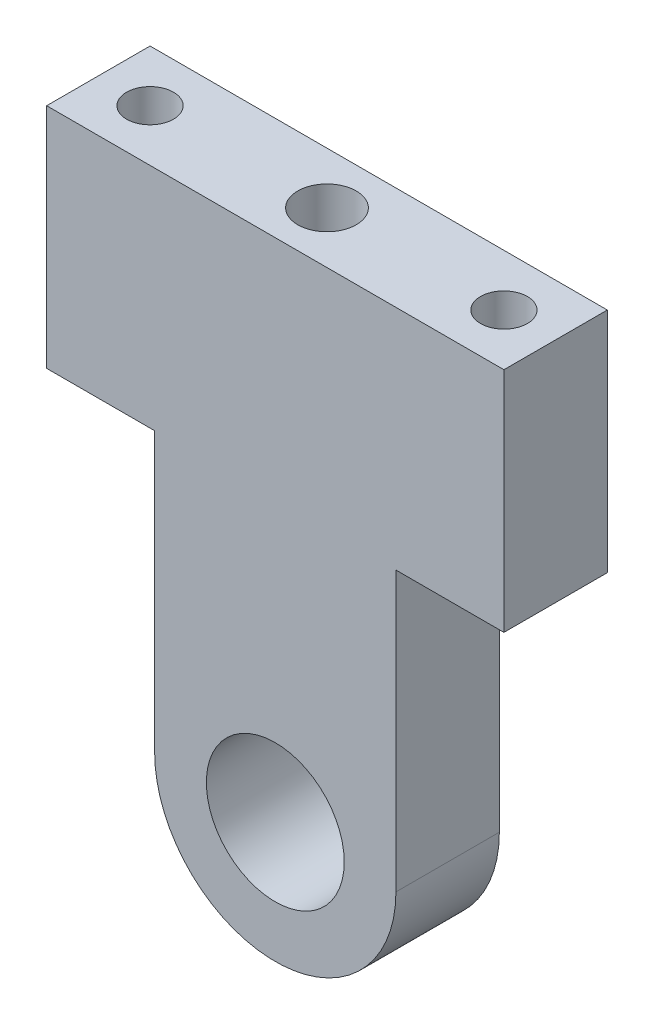
ISO-10303-21;
HEADER;
FILE_DESCRIPTION(('STEP AP214'),'2;1');
FILE_NAME('part.step','',(''),(''),'','','');
FILE_SCHEMA(('AUTOMOTIVE_DESIGN { 1 0 10303 214 1 1 1 1 }'));
ENDSEC;
DATA;
#1=APPLICATION_CONTEXT('core data for automotive mechanical design processes');
#2=APPLICATION_PROTOCOL_DEFINITION('international standard','automotive_design',2000,#1);
#3=PRODUCT_CONTEXT('',#1,'mechanical');
#4=PRODUCT('Part','Part','',(#3));
#5=PRODUCT_RELATED_PRODUCT_CATEGORY('part','',(#4));
#6=PRODUCT_DEFINITION_FORMATION('','',#4);
#7=PRODUCT_DEFINITION_CONTEXT('part definition',#1,'design');
#8=PRODUCT_DEFINITION('design','',#6,#7);
#9=PRODUCT_DEFINITION_SHAPE('','',#8);
#10=(LENGTH_UNIT() NAMED_UNIT(*) SI_UNIT(.MILLI.,.METRE.));
#11=(NAMED_UNIT(*) PLANE_ANGLE_UNIT() SI_UNIT($,.RADIAN.));
#12=(NAMED_UNIT(*) SI_UNIT($,.STERADIAN.) SOLID_ANGLE_UNIT());
#13=UNCERTAINTY_MEASURE_WITH_UNIT(LENGTH_MEASURE(1.E-05),#10,'distance_accuracy_value','');
#14=(GEOMETRIC_REPRESENTATION_CONTEXT(3) GLOBAL_UNCERTAINTY_ASSIGNED_CONTEXT((#13)) GLOBAL_UNIT_ASSIGNED_CONTEXT((#10,
#11,#12)) REPRESENTATION_CONTEXT('',''));
#15=CARTESIAN_POINT('',(0.,0.,0.));
#16=DIRECTION('',(0.,0.,1.));
#17=DIRECTION('',(1.,0.,0.));
#18=AXIS2_PLACEMENT_3D('',#15,#16,#17);
#19=CARTESIAN_POINT('',(33.165,-40.433566532219,15.));
#20=DIRECTION('',(0.,0.,1.));
#21=DIRECTION('',(1.,0.,0.));
#22=AXIS2_PLACEMENT_3D('',#19,#20,#21);
#23=PLANE('',#22);
#24=DIRECTION('',(1.,0.,0.));
#25=VECTOR('',#24,1.);
#26=CARTESIAN_POINT('',(0.,0.,15.));
#27=LINE('',#26,#25);
#28=CARTESIAN_POINT('',(0.,0.,15.));
#29=VERTEX_POINT('',#28);
#30=CARTESIAN_POINT('',(15.665,0.,15.));
#31=VERTEX_POINT('',#30);
#32=EDGE_CURVE('E151',#29,#31,#27,.T.);
#33=ORIENTED_EDGE('',*,*,#32,.T.);
#34=DIRECTION('',(0.,-1.,0.));
#35=VECTOR('',#34,1.);
#36=CARTESIAN_POINT('',(15.665,0.,15.));
#37=LINE('',#36,#35);
#38=CARTESIAN_POINT('',(15.665,-40.433566532219,15.));
#39=VERTEX_POINT('',#38);
#40=EDGE_CURVE('E99',#31,#39,#37,.T.);
#41=ORIENTED_EDGE('',*,*,#40,.T.);
#42=CARTESIAN_POINT('',(33.165,-40.433566532219,15.));
#43=DIRECTION('',(0.,0.,1.));
#44=DIRECTION('',(1.,0.,0.));
#45=AXIS2_PLACEMENT_3D('',#42,#43,#44);
#46=CIRCLE('',#45,17.5);
#47=CARTESIAN_POINT('',(50.665,-40.433566532219,15.));
#48=VERTEX_POINT('',#47);
#49=EDGE_CURVE('E166',#39,#48,#46,.T.);
#50=ORIENTED_EDGE('',*,*,#49,.T.);
#51=DIRECTION('',(0.,1.,0.));
#52=VECTOR('',#51,1.);
#53=CARTESIAN_POINT('',(50.665,0.,15.));
#54=LINE('',#53,#52);
#55=CARTESIAN_POINT('',(50.665,0.,15.));
#56=VERTEX_POINT('',#55);
#57=EDGE_CURVE('E179',#48,#56,#54,.T.);
#58=ORIENTED_EDGE('',*,*,#57,.T.);
#59=DIRECTION('',(1.,0.,0.));
#60=VECTOR('',#59,1.);
#61=CARTESIAN_POINT('',(50.665,0.,15.));
#62=LINE('',#61,#60);
#63=CARTESIAN_POINT('',(66.33,0.,15.));
#64=VERTEX_POINT('',#63);
#65=EDGE_CURVE('E118',#56,#64,#62,.T.);
#66=ORIENTED_EDGE('',*,*,#65,.T.);
#67=DIRECTION('',(0.,1.,0.));
#68=VECTOR('',#67,1.);
#69=CARTESIAN_POINT('',(66.33,0.,15.));
#70=LINE('',#69,#68);
#71=CARTESIAN_POINT('',(66.33,33.,15.));
#72=VERTEX_POINT('',#71);
#73=EDGE_CURVE('E112',#64,#72,#70,.T.);
#74=ORIENTED_EDGE('',*,*,#73,.T.);
#75=DIRECTION('',(-1.,0.,0.));
#76=VECTOR('',#75,1.);
#77=CARTESIAN_POINT('',(0.,33.,15.));
#78=LINE('',#77,#76);
#79=CARTESIAN_POINT('',(0.,33.,15.));
#80=VERTEX_POINT('',#79);
#81=EDGE_CURVE('E116',#72,#80,#78,.T.);
#82=ORIENTED_EDGE('',*,*,#81,.T.);
#83=DIRECTION('',(0.,-1.,0.));
#84=VECTOR('',#83,1.);
#85=CARTESIAN_POINT('',(0.,0.,15.));
#86=LINE('',#85,#84);
#87=EDGE_CURVE('E56',#80,#29,#86,.T.);
#88=ORIENTED_EDGE('',*,*,#87,.T.);
#89=EDGE_LOOP('',(#33,#41,#50,#58,#66,#74,#82,#88));
#90=FACE_BOUND('',#89,.T.);
#91=CARTESIAN_POINT('',(33.165,-40.433566532219,15.));
#92=DIRECTION('',(0.,0.,1.));
#93=DIRECTION('',(1.,0.,0.));
#94=AXIS2_PLACEMENT_3D('',#91,#92,#93);
#95=CIRCLE('',#94,10.);
#96=CARTESIAN_POINT('',(43.165,-40.433566532219,15.));
#97=VERTEX_POINT('',#96);
#98=EDGE_CURVE('E140',#97,#97,#95,.T.);
#99=ORIENTED_EDGE('',*,*,#98,.F.);
#100=EDGE_LOOP('',(#99));
#101=FACE_BOUND('',#100,.T.);
#102=ADVANCED_FACE('F39',(#90,#101),#23,.T.);
#103=CARTESIAN_POINT('',(33.165,-40.433566532219,0.));
#104=DIRECTION('',(0.,0.,1.));
#105=DIRECTION('',(1.,0.,0.));
#106=AXIS2_PLACEMENT_3D('',#103,#104,#105);
#107=PLANE('',#106);
#108=DIRECTION('',(1.,0.,0.));
#109=VECTOR('',#108,1.);
#110=CARTESIAN_POINT('',(0.,0.,0.));
#111=LINE('',#110,#109);
#112=CARTESIAN_POINT('',(0.,0.,0.));
#113=VERTEX_POINT('',#112);
#114=CARTESIAN_POINT('',(15.665,0.,0.));
#115=VERTEX_POINT('',#114);
#116=EDGE_CURVE('E136',#113,#115,#111,.T.);
#117=ORIENTED_EDGE('',*,*,#116,.F.);
#118=DIRECTION('',(0.,-1.,0.));
#119=VECTOR('',#118,1.);
#120=CARTESIAN_POINT('',(0.,0.,0.));
#121=LINE('',#120,#119);
#122=CARTESIAN_POINT('',(0.,33.,0.));
#123=VERTEX_POINT('',#122);
#124=EDGE_CURVE('E91',#123,#113,#121,.T.);
#125=ORIENTED_EDGE('',*,*,#124,.F.);
#126=DIRECTION('',(-1.,0.,0.));
#127=VECTOR('',#126,1.);
#128=CARTESIAN_POINT('',(0.,33.,0.));
#129=LINE('',#128,#127);
#130=CARTESIAN_POINT('',(66.33,33.,0.));
#131=VERTEX_POINT('',#130);
#132=EDGE_CURVE('E85',#131,#123,#129,.T.);
#133=ORIENTED_EDGE('',*,*,#132,.F.);
#134=DIRECTION('',(0.,1.,0.));
#135=VECTOR('',#134,1.);
#136=CARTESIAN_POINT('',(66.33,0.,0.));
#137=LINE('',#136,#135);
#138=CARTESIAN_POINT('',(66.33,0.,0.));
#139=VERTEX_POINT('',#138);
#140=EDGE_CURVE('E126',#139,#131,#137,.T.);
#141=ORIENTED_EDGE('',*,*,#140,.F.);
#142=DIRECTION('',(1.,0.,0.));
#143=VECTOR('',#142,1.);
#144=CARTESIAN_POINT('',(50.665,0.,0.));
#145=LINE('',#144,#143);
#146=CARTESIAN_POINT('',(50.665,0.,0.));
#147=VERTEX_POINT('',#146);
#148=EDGE_CURVE('E146',#147,#139,#145,.T.);
#149=ORIENTED_EDGE('',*,*,#148,.F.);
#150=DIRECTION('',(0.,1.,0.));
#151=VECTOR('',#150,1.);
#152=CARTESIAN_POINT('',(50.665,0.,0.));
#153=LINE('',#152,#151);
#154=CARTESIAN_POINT('',(50.665,-40.433566532219,0.));
#155=VERTEX_POINT('',#154);
#156=EDGE_CURVE('E144',#155,#147,#153,.T.);
#157=ORIENTED_EDGE('',*,*,#156,.F.);
#158=CARTESIAN_POINT('',(33.165,-40.433566532219,0.));
#159=DIRECTION('',(0.,0.,1.));
#160=DIRECTION('',(1.,0.,0.));
#161=AXIS2_PLACEMENT_3D('',#158,#159,#160);
#162=CIRCLE('',#161,17.5);
#163=CARTESIAN_POINT('',(15.665,-40.433566532219,0.));
#164=VERTEX_POINT('',#163);
#165=EDGE_CURVE('E142',#164,#155,#162,.T.);
#166=ORIENTED_EDGE('',*,*,#165,.F.);
#167=DIRECTION('',(0.,-1.,0.));
#168=VECTOR('',#167,1.);
#169=CARTESIAN_POINT('',(15.665,0.,0.));
#170=LINE('',#169,#168);
#171=EDGE_CURVE('E139',#115,#164,#170,.T.);
#172=ORIENTED_EDGE('',*,*,#171,.F.);
#173=EDGE_LOOP('',(#117,#125,#133,#141,#149,#157,#166,#172));
#174=FACE_BOUND('',#173,.T.);
#175=CARTESIAN_POINT('',(33.165,-40.433566532219,0.));
#176=DIRECTION('',(0.,0.,1.));
#177=DIRECTION('',(1.,0.,0.));
#178=AXIS2_PLACEMENT_3D('',#175,#176,#177);
#179=CIRCLE('',#178,10.);
#180=CARTESIAN_POINT('',(43.165,-40.433566532219,0.));
#181=VERTEX_POINT('',#180);
#182=EDGE_CURVE('E185',#181,#181,#179,.T.);
#183=ORIENTED_EDGE('',*,*,#182,.T.);
#184=EDGE_LOOP('',(#183));
#185=FACE_BOUND('',#184,.T.);
#186=ADVANCED_FACE('F170',(#174,#185),#107,.F.);
#187=CARTESIAN_POINT('',(0.,0.,15.));
#188=DIRECTION('',(0.,1.,0.));
#189=DIRECTION('',(-1.,0.,0.));
#190=AXIS2_PLACEMENT_3D('',#187,#188,#189);
#191=PLANE('',#190);
#192=CARTESIAN_POINT('',(7.499,0.,7.5));
#193=DIRECTION('',(0.,1.,0.));
#194=DIRECTION('',(-1.,0.,0.));
#195=AXIS2_PLACEMENT_3D('',#192,#193,#194);
#196=CIRCLE('',#195,3.4);
#197=CARTESIAN_POINT('',(4.099,0.,7.5));
#198=VERTEX_POINT('',#197);
#199=EDGE_CURVE('E193',#198,#198,#196,.T.);
#200=ORIENTED_EDGE('',*,*,#199,.T.);
#201=EDGE_LOOP('',(#200));
#202=FACE_BOUND('',#201,.T.);
#203=ORIENTED_EDGE('',*,*,#116,.T.);
#204=DIRECTION('',(0.,0.,-1.));
#205=VECTOR('',#204,1.);
#206=CARTESIAN_POINT('',(15.665,0.,15.));
#207=LINE('',#206,#205);
#208=EDGE_CURVE('E11',#31,#115,#207,.T.);
#209=ORIENTED_EDGE('',*,*,#208,.F.);
#210=ORIENTED_EDGE('',*,*,#32,.F.);
#211=DIRECTION('',(0.,0.,-1.));
#212=VECTOR('',#211,1.);
#213=CARTESIAN_POINT('',(0.,0.,15.));
#214=LINE('',#213,#212);
#215=EDGE_CURVE('E132',#29,#113,#214,.T.);
#216=ORIENTED_EDGE('',*,*,#215,.T.);
#217=EDGE_LOOP('',(#203,#209,#210,#216));
#218=FACE_BOUND('',#217,.T.);
#219=ADVANCED_FACE('F41',(#202,#218),#191,.F.);
#220=CARTESIAN_POINT('',(15.665,0.,15.));
#221=DIRECTION('',(1.,0.,0.));
#222=DIRECTION('',(0.,1.,0.));
#223=AXIS2_PLACEMENT_3D('',#220,#221,#222);
#224=PLANE('',#223);
#225=ORIENTED_EDGE('',*,*,#171,.T.);
#226=DIRECTION('',(0.,0.,-1.));
#227=VECTOR('',#226,1.);
#228=CARTESIAN_POINT('',(15.665,-40.433566532219,15.));
#229=LINE('',#228,#227);
#230=EDGE_CURVE('E48',#39,#164,#229,.T.);
#231=ORIENTED_EDGE('',*,*,#230,.F.);
#232=ORIENTED_EDGE('',*,*,#40,.F.);
#233=ORIENTED_EDGE('',*,*,#208,.T.);
#234=EDGE_LOOP('',(#225,#231,#232,#233));
#235=FACE_BOUND('',#234,.T.);
#236=ADVANCED_FACE('F235',(#235),#224,.F.);
#237=CARTESIAN_POINT('',(33.165,-40.433566532219,15.));
#238=DIRECTION('',(0.,0.,-1.));
#239=DIRECTION('',(-1.,0.,0.));
#240=AXIS2_PLACEMENT_3D('',#237,#238,#239);
#241=CYLINDRICAL_SURFACE('',#240,17.5);
#242=ORIENTED_EDGE('',*,*,#165,.T.);
#243=DIRECTION('',(0.,0.,-1.));
#244=VECTOR('',#243,1.);
#245=CARTESIAN_POINT('',(50.665,-40.433566532219,15.));
#246=LINE('',#245,#244);
#247=EDGE_CURVE('E158',#48,#155,#246,.T.);
#248=ORIENTED_EDGE('',*,*,#247,.F.);
#249=ORIENTED_EDGE('',*,*,#49,.F.);
#250=ORIENTED_EDGE('',*,*,#230,.T.);
#251=EDGE_LOOP('',(#242,#248,#249,#250));
#252=FACE_BOUND('',#251,.T.);
#253=ADVANCED_FACE('F164',(#252),#241,.T.);
#254=CARTESIAN_POINT('',(50.665,0.,15.));
#255=DIRECTION('',(-1.,0.,0.));
#256=DIRECTION('',(0.,-1.,0.));
#257=AXIS2_PLACEMENT_3D('',#254,#255,#256);
#258=PLANE('',#257);
#259=ORIENTED_EDGE('',*,*,#156,.T.);
#260=DIRECTION('',(0.,0.,-1.));
#261=VECTOR('',#260,1.);
#262=CARTESIAN_POINT('',(50.665,0.,15.));
#263=LINE('',#262,#261);
#264=EDGE_CURVE('E155',#56,#147,#263,.T.);
#265=ORIENTED_EDGE('',*,*,#264,.F.);
#266=ORIENTED_EDGE('',*,*,#57,.F.);
#267=ORIENTED_EDGE('',*,*,#247,.T.);
#268=EDGE_LOOP('',(#259,#265,#266,#267));
#269=FACE_BOUND('',#268,.T.);
#270=ADVANCED_FACE('F175',(#269),#258,.F.);
#271=CARTESIAN_POINT('',(50.665,0.,15.));
#272=DIRECTION('',(0.,1.,0.));
#273=DIRECTION('',(-1.,0.,0.));
#274=AXIS2_PLACEMENT_3D('',#271,#272,#273);
#275=PLANE('',#274);
#276=CARTESIAN_POINT('',(58.831,0.,7.5));
#277=DIRECTION('',(0.,1.,0.));
#278=DIRECTION('',(-1.,0.,0.));
#279=AXIS2_PLACEMENT_3D('',#276,#277,#278);
#280=CIRCLE('',#279,3.4);
#281=CARTESIAN_POINT('',(55.431,0.,7.5));
#282=VERTEX_POINT('',#281);
#283=EDGE_CURVE('E188',#282,#282,#280,.T.);
#284=ORIENTED_EDGE('',*,*,#283,.T.);
#285=EDGE_LOOP('',(#284));
#286=FACE_BOUND('',#285,.T.);
#287=ORIENTED_EDGE('',*,*,#148,.T.);
#288=DIRECTION('',(0.,0.,-1.));
#289=VECTOR('',#288,1.);
#290=CARTESIAN_POINT('',(66.33,0.,15.));
#291=LINE('',#290,#289);
#292=EDGE_CURVE('E127',#64,#139,#291,.T.);
#293=ORIENTED_EDGE('',*,*,#292,.F.);
#294=ORIENTED_EDGE('',*,*,#65,.F.);
#295=ORIENTED_EDGE('',*,*,#264,.T.);
#296=EDGE_LOOP('',(#287,#293,#294,#295));
#297=FACE_BOUND('',#296,.T.);
#298=ADVANCED_FACE('F178',(#286,#297),#275,.F.);
#299=CARTESIAN_POINT('',(66.33,0.,15.));
#300=DIRECTION('',(-1.,0.,0.));
#301=DIRECTION('',(0.,0.,1.));
#302=AXIS2_PLACEMENT_3D('',#299,#300,#301);
#303=PLANE('',#302);
#304=ORIENTED_EDGE('',*,*,#140,.T.);
#305=DIRECTION('',(0.,0.,-1.));
#306=VECTOR('',#305,1.);
#307=CARTESIAN_POINT('',(66.33,33.,15.));
#308=LINE('',#307,#306);
#309=EDGE_CURVE('E123',#72,#131,#308,.T.);
#310=ORIENTED_EDGE('',*,*,#309,.F.);
#311=ORIENTED_EDGE('',*,*,#73,.F.);
#312=ORIENTED_EDGE('',*,*,#292,.T.);
#313=EDGE_LOOP('',(#304,#310,#311,#312));
#314=FACE_BOUND('',#313,.T.);
#315=ADVANCED_FACE('F124',(#314),#303,.F.);
#316=CARTESIAN_POINT('',(0.,33.,15.));
#317=DIRECTION('',(0.,-1.,0.));
#318=DIRECTION('',(0.,0.,-1.));
#319=AXIS2_PLACEMENT_3D('',#316,#317,#318);
#320=PLANE('',#319);
#321=CARTESIAN_POINT('',(33.165,33.,7.5));
#322=DIRECTION('',(0.,1.,0.));
#323=DIRECTION('',(0.,0.,1.));
#324=AXIS2_PLACEMENT_3D('',#321,#322,#323);
#325=CIRCLE('',#324,4.25000000000001);
#326=CARTESIAN_POINT('',(33.165,33.,11.75));
#327=VERTEX_POINT('',#326);
#328=EDGE_CURVE('E203',#327,#327,#325,.T.);
#329=ORIENTED_EDGE('',*,*,#328,.F.);
#330=EDGE_LOOP('',(#329));
#331=FACE_BOUND('',#330,.T.);
#332=CARTESIAN_POINT('',(58.831,33.,7.5));
#333=DIRECTION('',(0.,1.,0.));
#334=DIRECTION('',(0.,0.,1.));
#335=AXIS2_PLACEMENT_3D('',#332,#333,#334);
#336=CIRCLE('',#335,3.4);
#337=CARTESIAN_POINT('',(58.831,33.,10.9));
#338=VERTEX_POINT('',#337);
#339=EDGE_CURVE('E196',#338,#338,#336,.T.);
#340=ORIENTED_EDGE('',*,*,#339,.F.);
#341=EDGE_LOOP('',(#340));
#342=FACE_BOUND('',#341,.T.);
#343=CARTESIAN_POINT('',(7.499,33.,7.5));
#344=DIRECTION('',(0.,1.,0.));
#345=DIRECTION('',(0.,0.,-1.));
#346=AXIS2_PLACEMENT_3D('',#343,#344,#345);
#347=CIRCLE('',#346,3.4);
#348=CARTESIAN_POINT('',(7.499,33.,4.1));
#349=VERTEX_POINT('',#348);
#350=EDGE_CURVE('E197',#349,#349,#347,.T.);
#351=ORIENTED_EDGE('',*,*,#350,.F.);
#352=EDGE_LOOP('',(#351));
#353=FACE_BOUND('',#352,.T.);
#354=ORIENTED_EDGE('',*,*,#132,.T.);
#355=DIRECTION('',(0.,0.,-1.));
#356=VECTOR('',#355,1.);
#357=CARTESIAN_POINT('',(0.,33.,15.));
#358=LINE('',#357,#356);
#359=EDGE_CURVE('E128',#80,#123,#358,.T.);
#360=ORIENTED_EDGE('',*,*,#359,.F.);
#361=ORIENTED_EDGE('',*,*,#81,.F.);
#362=ORIENTED_EDGE('',*,*,#309,.T.);
#363=EDGE_LOOP('',(#354,#360,#361,#362));
#364=FACE_BOUND('',#363,.T.);
#365=ADVANCED_FACE('F130',(#331,#342,#353,#364),#320,.F.);
#366=CARTESIAN_POINT('',(0.,0.,15.));
#367=DIRECTION('',(1.,0.,0.));
#368=DIRECTION('',(0.,0.,-1.));
#369=AXIS2_PLACEMENT_3D('',#366,#367,#368);
#370=PLANE('',#369);
#371=ORIENTED_EDGE('',*,*,#124,.T.);
#372=ORIENTED_EDGE('',*,*,#215,.F.);
#373=ORIENTED_EDGE('',*,*,#87,.F.);
#374=ORIENTED_EDGE('',*,*,#359,.T.);
#375=EDGE_LOOP('',(#371,#372,#373,#374));
#376=FACE_BOUND('',#375,.T.);
#377=ADVANCED_FACE('F220',(#376),#370,.F.);
#378=CARTESIAN_POINT('',(33.165,-40.433566532219,15.));
#379=DIRECTION('',(0.,0.,-1.));
#380=DIRECTION('',(-1.,0.,0.));
#381=AXIS2_PLACEMENT_3D('',#378,#379,#380);
#382=CYLINDRICAL_SURFACE('',#381,10.);
#383=ORIENTED_EDGE('',*,*,#98,.T.);
#384=EDGE_LOOP('',(#383));
#385=FACE_BOUND('',#384,.T.);
#386=ORIENTED_EDGE('',*,*,#182,.F.);
#387=EDGE_LOOP('',(#386));
#388=FACE_BOUND('',#387,.T.);
#389=ADVANCED_FACE('F229',(#385,#388),#382,.F.);
#390=CARTESIAN_POINT('',(7.499,-21.,7.5));
#391=DIRECTION('',(0.,1.,0.));
#392=DIRECTION('',(0.,0.,1.));
#393=AXIS2_PLACEMENT_3D('',#390,#391,#392);
#394=CYLINDRICAL_SURFACE('',#393,3.4);
#395=ORIENTED_EDGE('',*,*,#350,.T.);
#396=EDGE_LOOP('',(#395));
#397=FACE_BOUND('',#396,.T.);
#398=ORIENTED_EDGE('',*,*,#199,.F.);
#399=EDGE_LOOP('',(#398));
#400=FACE_BOUND('',#399,.T.);
#401=ADVANCED_FACE('F226',(#397,#400),#394,.F.);
#402=CARTESIAN_POINT('',(58.831,-21.,7.5));
#403=DIRECTION('',(0.,1.,0.));
#404=DIRECTION('',(0.,0.,1.));
#405=AXIS2_PLACEMENT_3D('',#402,#403,#404);
#406=CYLINDRICAL_SURFACE('',#405,3.4);
#407=ORIENTED_EDGE('',*,*,#339,.T.);
#408=EDGE_LOOP('',(#407));
#409=FACE_BOUND('',#408,.T.);
#410=ORIENTED_EDGE('',*,*,#283,.F.);
#411=EDGE_LOOP('',(#410));
#412=FACE_BOUND('',#411,.T.);
#413=ADVANCED_FACE('F214',(#409,#412),#406,.F.);
#414=CARTESIAN_POINT('',(33.165,5.,7.5));
#415=DIRECTION('',(0.,1.,0.));
#416=DIRECTION('',(0.,0.,1.));
#417=AXIS2_PLACEMENT_3D('',#414,#415,#416);
#418=CYLINDRICAL_SURFACE('',#417,4.25000000000001);
#419=CARTESIAN_POINT('',(33.165,5.,7.5));
#420=DIRECTION('',(0.,1.,0.));
#421=DIRECTION('',(0.,0.,1.));
#422=AXIS2_PLACEMENT_3D('',#419,#420,#421);
#423=CIRCLE('',#422,4.25000000000001);
#424=CARTESIAN_POINT('',(33.165,5.,11.75));
#425=VERTEX_POINT('',#424);
#426=EDGE_CURVE('E200',#425,#425,#423,.T.);
#427=ORIENTED_EDGE('',*,*,#426,.F.);
#428=EDGE_LOOP('',(#427));
#429=FACE_BOUND('',#428,.T.);
#430=ORIENTED_EDGE('',*,*,#328,.T.);
#431=EDGE_LOOP('',(#430));
#432=FACE_BOUND('',#431,.T.);
#433=ADVANCED_FACE('F211',(#429,#432),#418,.F.);
#434=CARTESIAN_POINT('',(33.165,5.,7.5));
#435=DIRECTION('',(0.,1.,0.));
#436=DIRECTION('',(0.,0.,1.));
#437=AXIS2_PLACEMENT_3D('',#434,#435,#436);
#438=PLANE('',#437);
#439=ORIENTED_EDGE('',*,*,#426,.T.);
#440=EDGE_LOOP('',(#439));
#441=FACE_BOUND('',#440,.T.);
#442=ADVANCED_FACE('F209',(#441),#438,.T.);
#443=CLOSED_SHELL('',(#102,#186,#219,#236,#253,#270,#298,#315,#365,#377,#389,#401,#413,#433,#442));
#444=MANIFOLD_SOLID_BREP('B2',#443);
#445=ADVANCED_BREP_SHAPE_REPRESENTATION('',(#18,#444),#14);
#446=SHAPE_DEFINITION_REPRESENTATION(#9,#445);
ENDSEC;
END-ISO-10303-21;
